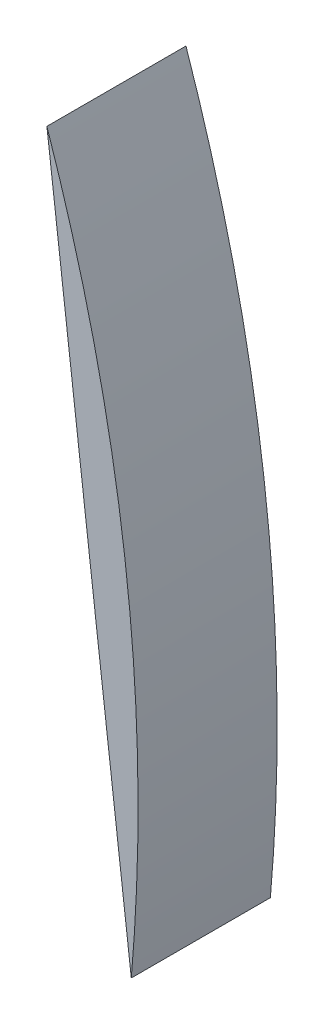
ISO-10303-21;
HEADER;
FILE_DESCRIPTION(('STEP AP214'),'2;1');
FILE_NAME('part.step','',(''),(''),'','','');
FILE_SCHEMA(('AUTOMOTIVE_DESIGN { 1 0 10303 214 1 1 1 1 }'));
ENDSEC;
DATA;
#1=APPLICATION_CONTEXT('core data for automotive mechanical design processes');
#2=APPLICATION_PROTOCOL_DEFINITION('international standard','automotive_design',2000,#1);
#3=PRODUCT_CONTEXT('',#1,'mechanical');
#4=PRODUCT('Part','Part','',(#3));
#5=PRODUCT_RELATED_PRODUCT_CATEGORY('part','',(#4));
#6=PRODUCT_DEFINITION_FORMATION('','',#4);
#7=PRODUCT_DEFINITION_CONTEXT('part definition',#1,'design');
#8=PRODUCT_DEFINITION('design','',#6,#7);
#9=PRODUCT_DEFINITION_SHAPE('','',#8);
#10=(LENGTH_UNIT() NAMED_UNIT(*) SI_UNIT(.MILLI.,.METRE.));
#11=(NAMED_UNIT(*) PLANE_ANGLE_UNIT() SI_UNIT($,.RADIAN.));
#12=(NAMED_UNIT(*) SI_UNIT($,.STERADIAN.) SOLID_ANGLE_UNIT());
#13=UNCERTAINTY_MEASURE_WITH_UNIT(LENGTH_MEASURE(1.E-05),#10,'distance_accuracy_value','');
#14=(GEOMETRIC_REPRESENTATION_CONTEXT(3) GLOBAL_UNCERTAINTY_ASSIGNED_CONTEXT((#13)) GLOBAL_UNIT_ASSIGNED_CONTEXT((#10,
#11,#12)) REPRESENTATION_CONTEXT('',''));
#15=CARTESIAN_POINT('',(0.,0.,0.));
#16=DIRECTION('',(0.,0.,1.));
#17=DIRECTION('',(1.,0.,0.));
#18=AXIS2_PLACEMENT_3D('',#15,#16,#17);
#19=CARTESIAN_POINT('',(0.,0.,100.));
#20=CARTESIAN_POINT('',(22.7090775358605,255.620760675042,100.));
#21=CARTESIAN_POINT('',(-60.693641618497,500.,100.));
#22=B_SPLINE_CURVE_WITH_KNOTS('',2,(#19,#20,#21),.UNSPECIFIED.,.F.,.F.,(3,3),(0.,1.),.UNSPECIFIED.);
#23=DIRECTION('',(0.,0.,-1.));
#24=VECTOR('',#23,1.);
#25=SURFACE_OF_LINEAR_EXTRUSION('',#22,#24);
#26=CARTESIAN_POINT('',(0.,0.,0.));
#27=CARTESIAN_POINT('',(22.7090775358605,255.620760675042,0.));
#28=CARTESIAN_POINT('',(-60.693641618497,500.,0.));
#29=B_SPLINE_CURVE_WITH_KNOTS('',2,(#26,#27,#28),.UNSPECIFIED.,.F.,.F.,(3,3),(0.,1.),.UNSPECIFIED.);
#30=CARTESIAN_POINT('',(0.,0.,0.));
#31=VERTEX_POINT('',#30);
#32=CARTESIAN_POINT('',(-60.693641618497,500.,0.));
#33=VERTEX_POINT('',#32);
#34=EDGE_CURVE('E66',#31,#33,#29,.T.);
#35=ORIENTED_EDGE('',*,*,#34,.T.);
#36=DIRECTION('',(0.,0.,-1.));
#37=VECTOR('',#36,1.);
#38=CARTESIAN_POINT('',(-60.693641618497,500.,100.));
#39=LINE('',#38,#37);
#40=CARTESIAN_POINT('',(-60.693641618497,500.,100.));
#41=VERTEX_POINT('',#40);
#42=EDGE_CURVE('E11',#41,#33,#39,.T.);
#43=ORIENTED_EDGE('',*,*,#42,.F.);
#44=CARTESIAN_POINT('',(0.,0.,100.));
#45=VERTEX_POINT('',#44);
#46=EDGE_CURVE('E65',#45,#41,#22,.T.);
#47=ORIENTED_EDGE('',*,*,#46,.F.);
#48=DIRECTION('',(0.,0.,-1.));
#49=VECTOR('',#48,1.);
#50=CARTESIAN_POINT('',(0.,0.,100.));
#51=LINE('',#50,#49);
#52=EDGE_CURVE('E43',#45,#31,#51,.T.);
#53=ORIENTED_EDGE('',*,*,#52,.T.);
#54=EDGE_LOOP('',(#35,#43,#47,#53));
#55=FACE_BOUND('',#54,.T.);
#56=ADVANCED_FACE('F34',(#55),#25,.F.);
#57=CARTESIAN_POINT('',(0.,0.,100.));
#58=DIRECTION('',(0.992712995386093,0.120502733543976,0.));
#59=DIRECTION('',(-0.120502733543977,0.992712995386093,0.));
#60=AXIS2_PLACEMENT_3D('',#57,#58,#59);
#61=PLANE('',#60);
#62=DIRECTION('',(0.120502733543976,-0.992712995386093,0.));
#63=VECTOR('',#62,1.);
#64=CARTESIAN_POINT('',(0.,0.,0.));
#65=LINE('',#64,#63);
#66=EDGE_CURVE('E58',#33,#31,#65,.T.);
#67=ORIENTED_EDGE('',*,*,#66,.T.);
#68=ORIENTED_EDGE('',*,*,#52,.F.);
#69=DIRECTION('',(0.120502733543976,-0.992712995386093,0.));
#70=VECTOR('',#69,1.);
#71=CARTESIAN_POINT('',(0.,0.,100.));
#72=LINE('',#71,#70);
#73=EDGE_CURVE('E50',#41,#45,#72,.T.);
#74=ORIENTED_EDGE('',*,*,#73,.F.);
#75=ORIENTED_EDGE('',*,*,#42,.T.);
#76=EDGE_LOOP('',(#67,#68,#74,#75));
#77=FACE_BOUND('',#76,.T.);
#78=ADVANCED_FACE('F61',(#77),#61,.F.);
#79=CARTESIAN_POINT('',(-3.818871636694,252.810380337521,100.));
#80=DIRECTION('',(0.,0.,-1.));
#81=DIRECTION('',(-1.,0.,0.));
#82=AXIS2_PLACEMENT_3D('',#79,#80,#81);
#83=PLANE('',#82);
#84=ORIENTED_EDGE('',*,*,#46,.T.);
#85=ORIENTED_EDGE('',*,*,#73,.T.);
#86=EDGE_LOOP('',(#84,#85));
#87=FACE_BOUND('',#86,.T.);
#88=ADVANCED_FACE('F83',(#87),#83,.F.);
#89=CARTESIAN_POINT('',(-3.818871636694,252.810380337521,0.));
#90=DIRECTION('',(0.,0.,-1.));
#91=DIRECTION('',(-1.,0.,0.));
#92=AXIS2_PLACEMENT_3D('',#89,#90,#91);
#93=PLANE('',#92);
#94=ORIENTED_EDGE('',*,*,#34,.F.);
#95=ORIENTED_EDGE('',*,*,#66,.F.);
#96=EDGE_LOOP('',(#94,#95));
#97=FACE_BOUND('',#96,.T.);
#98=ADVANCED_FACE('F69',(#97),#93,.T.);
#99=CLOSED_SHELL('',(#56,#78,#88,#98));
#100=MANIFOLD_SOLID_BREP('B2',#99);
#101=ADVANCED_BREP_SHAPE_REPRESENTATION('',(#18,#100),#14);
#102=SHAPE_DEFINITION_REPRESENTATION(#9,#101);
ENDSEC;
END-ISO-10303-21;
